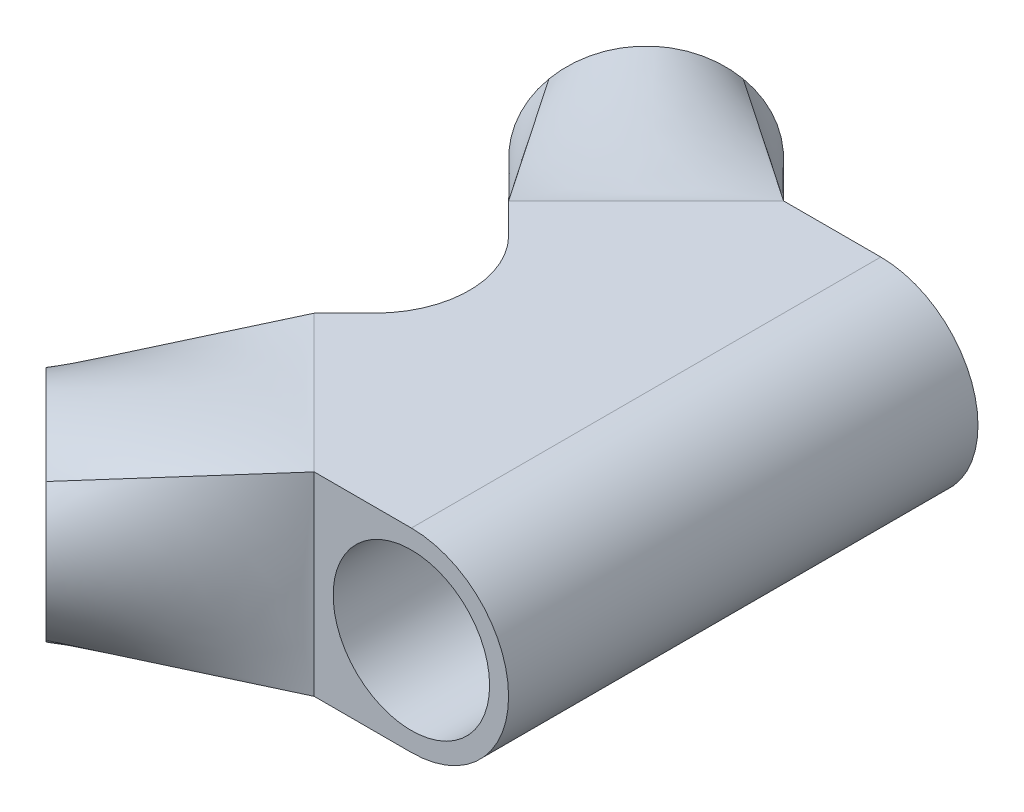
ISO-10303-21;
HEADER;
FILE_DESCRIPTION(('STEP AP214'),'2;1');
FILE_NAME('part.step','',(''),(''),'','','');
FILE_SCHEMA(('AUTOMOTIVE_DESIGN { 1 0 10303 214 1 1 1 1 }'));
ENDSEC;
DATA;
#1=APPLICATION_CONTEXT('core data for automotive mechanical design processes');
#2=APPLICATION_PROTOCOL_DEFINITION('international standard','automotive_design',2000,#1);
#3=PRODUCT_CONTEXT('',#1,'mechanical');
#4=PRODUCT('Part','Part','',(#3));
#5=PRODUCT_RELATED_PRODUCT_CATEGORY('part','',(#4));
#6=PRODUCT_DEFINITION_FORMATION('','',#4);
#7=PRODUCT_DEFINITION_CONTEXT('part definition',#1,'design');
#8=PRODUCT_DEFINITION('design','',#6,#7);
#9=PRODUCT_DEFINITION_SHAPE('','',#8);
#10=(LENGTH_UNIT() NAMED_UNIT(*) SI_UNIT(.MILLI.,.METRE.));
#11=(NAMED_UNIT(*) PLANE_ANGLE_UNIT() SI_UNIT($,.RADIAN.));
#12=(NAMED_UNIT(*) SI_UNIT($,.STERADIAN.) SOLID_ANGLE_UNIT());
#13=UNCERTAINTY_MEASURE_WITH_UNIT(LENGTH_MEASURE(1.E-05),#10,'distance_accuracy_value','');
#14=(GEOMETRIC_REPRESENTATION_CONTEXT(3) GLOBAL_UNCERTAINTY_ASSIGNED_CONTEXT((#13)) GLOBAL_UNIT_ASSIGNED_CONTEXT((#10,
#11,#12)) REPRESENTATION_CONTEXT('',''));
#15=CARTESIAN_POINT('',(0.,0.,0.));
#16=DIRECTION('',(0.,0.,1.));
#17=DIRECTION('',(1.,0.,0.));
#18=AXIS2_PLACEMENT_3D('',#15,#16,#17);
#19=CARTESIAN_POINT('',(0.,0.,49.5));
#20=DIRECTION('',(0.,0.,-1.));
#21=DIRECTION('',(-1.,0.,0.));
#22=AXIS2_PLACEMENT_3D('',#19,#20,#21);
#23=CYLINDRICAL_SURFACE('',#22,10.25);
#24=CARTESIAN_POINT('',(0.,0.,0.));
#25=DIRECTION('',(0.,0.,1.));
#26=DIRECTION('',(1.,0.,0.));
#27=AXIS2_PLACEMENT_3D('',#24,#25,#26);
#28=CIRCLE('',#27,10.25);
#29=CARTESIAN_POINT('',(0.,-10.25,0.));
#30=VERTEX_POINT('',#29);
#31=CARTESIAN_POINT('',(0.,10.25,0.));
#32=VERTEX_POINT('',#31);
#33=EDGE_CURVE('E484',#30,#32,#28,.T.);
#34=ORIENTED_EDGE('',*,*,#33,.T.);
#35=DIRECTION('',(0.,0.,-1.));
#36=VECTOR('',#35,1.);
#37=CARTESIAN_POINT('',(0.,10.25,49.5));
#38=LINE('',#37,#36);
#39=CARTESIAN_POINT('',(0.,10.25,49.5));
#40=VERTEX_POINT('',#39);
#41=EDGE_CURVE('E494',#40,#32,#38,.T.);
#42=ORIENTED_EDGE('',*,*,#41,.F.);
#43=CARTESIAN_POINT('',(0.,0.,49.5));
#44=DIRECTION('',(0.,0.,1.));
#45=DIRECTION('',(1.,0.,0.));
#46=AXIS2_PLACEMENT_3D('',#43,#44,#45);
#47=CIRCLE('',#46,10.25);
#48=CARTESIAN_POINT('',(0.,-10.25,49.5));
#49=VERTEX_POINT('',#48);
#50=EDGE_CURVE('E474',#49,#40,#47,.T.);
#51=ORIENTED_EDGE('',*,*,#50,.F.);
#52=DIRECTION('',(0.,0.,-1.));
#53=VECTOR('',#52,1.);
#54=CARTESIAN_POINT('',(0.,-10.25,49.5));
#55=LINE('',#54,#53);
#56=EDGE_CURVE('E490',#49,#30,#55,.T.);
#57=ORIENTED_EDGE('',*,*,#56,.T.);
#58=EDGE_LOOP('',(#34,#42,#51,#57));
#59=FACE_BOUND('',#58,.T.);
#60=ADVANCED_FACE('F97',(#59),#23,.T.);
#61=CARTESIAN_POINT('',(0.,10.25,49.5));
#62=DIRECTION('',(0.,-1.,0.));
#63=DIRECTION('',(0.,0.,-1.));
#64=AXIS2_PLACEMENT_3D('',#61,#62,#63);
#65=PLANE('',#64);
#66=DIRECTION('',(-1.,0.,0.));
#67=VECTOR('',#66,1.);
#68=CARTESIAN_POINT('',(0.,10.25,0.));
#69=LINE('',#68,#67);
#70=CARTESIAN_POINT('',(-10.25,10.25,0.00215549283784562));
#71=VERTEX_POINT('',#70);
#72=EDGE_CURVE('E489',#32,#71,#69,.T.);
#73=ORIENTED_EDGE('',*,*,#72,.T.);
#74=DIRECTION('',(-0.707106781186549,0.,0.707106781186546));
#75=VECTOR('',#74,1.);
#76=CARTESIAN_POINT('',(-10.2500000000002,10.25,0.00431098567550692));
#77=LINE('',#76,#75);
#78=CARTESIAN_POINT('',(-24.7456890143244,10.25,14.4999999999997));
#79=VERTEX_POINT('',#78);
#80=EDGE_CURVE('E520',#71,#79,#77,.T.);
#81=ORIENTED_EDGE('',*,*,#80,.T.);
#82=DIRECTION('',(0.707106781186544,0.,0.707106781186551));
#83=VECTOR('',#82,1.);
#84=CARTESIAN_POINT('',(-19.6228445071622,10.25,19.622844507162));
#85=LINE('',#84,#83);
#86=CARTESIAN_POINT('',(-21.5667568261897,10.25,17.6789321881345));
#87=VERTEX_POINT('',#86);
#88=EDGE_CURVE('E517',#79,#87,#85,.T.);
#89=ORIENTED_EDGE('',*,*,#88,.T.);
#90=CARTESIAN_POINT('',(-28.6378246380552,10.25,24.7499999999999));
#91=DIRECTION('',(0.,-1.,0.));
#92=DIRECTION('',(0.,0.,-1.));
#93=AXIS2_PLACEMENT_3D('',#90,#91,#92);
#94=CIRCLE('',#93,10.);
#95=CARTESIAN_POINT('',(-21.5667568261897,10.25,31.8210678118654));
#96=VERTEX_POINT('',#95);
#97=EDGE_CURVE('E12',#87,#96,#94,.T.);
#98=ORIENTED_EDGE('',*,*,#97,.T.);
#99=DIRECTION('',(0.70710678118655,0.,-0.707106781186546));
#100=VECTOR('',#99,1.);
#101=CARTESIAN_POINT('',(5.12715549283791,10.25,5.12715549283794));
#102=LINE('',#101,#100);
#103=CARTESIAN_POINT('',(-24.7456890143243,10.25,35.));
#104=VERTEX_POINT('',#103);
#105=EDGE_CURVE('E521',#104,#96,#102,.T.);
#106=ORIENTED_EDGE('',*,*,#105,.F.);
#107=DIRECTION('',(0.707106781186546,0.,0.707106781186549));
#108=VECTOR('',#107,1.);
#109=CARTESIAN_POINT('',(-24.7456890143243,10.25,34.9999999999999));
#110=LINE('',#109,#108);
#111=CARTESIAN_POINT('',(-10.25,10.25,49.4978445071621));
#112=VERTEX_POINT('',#111);
#113=EDGE_CURVE('E349',#104,#112,#110,.T.);
#114=ORIENTED_EDGE('',*,*,#113,.T.);
#115=DIRECTION('',(-1.,0.,0.));
#116=VECTOR('',#115,1.);
#117=CARTESIAN_POINT('',(0.,10.25,49.5));
#118=LINE('',#117,#116);
#119=EDGE_CURVE('E479',#40,#112,#118,.T.);
#120=ORIENTED_EDGE('',*,*,#119,.F.);
#121=ORIENTED_EDGE('',*,*,#41,.T.);
#122=EDGE_LOOP('',(#73,#81,#89,#98,#106,#114,#120,#121));
#123=FACE_BOUND('',#122,.T.);
#124=ADVANCED_FACE('F608',(#123),#65,.F.);
#125=CARTESIAN_POINT('',(0.,0.,49.5));
#126=DIRECTION('',(0.,0.,-1.));
#127=DIRECTION('',(-1.,0.,0.));
#128=AXIS2_PLACEMENT_3D('',#125,#126,#127);
#129=CYLINDRICAL_SURFACE('',#128,8.25);
#130=CARTESIAN_POINT('',(0.,0.,49.5));
#131=DIRECTION('',(0.,0.,1.));
#132=DIRECTION('',(1.,0.,0.));
#133=AXIS2_PLACEMENT_3D('',#130,#131,#132);
#134=CIRCLE('',#133,8.25);
#135=CARTESIAN_POINT('',(8.25,0.,49.5));
#136=VERTEX_POINT('',#135);
#137=EDGE_CURVE('E465',#136,#136,#134,.T.);
#138=ORIENTED_EDGE('',*,*,#137,.T.);
#139=EDGE_LOOP('',(#138));
#140=FACE_BOUND('',#139,.T.);
#141=CARTESIAN_POINT('',(0.,0.,0.));
#142=DIRECTION('',(0.,0.,1.));
#143=DIRECTION('',(1.,0.,0.));
#144=AXIS2_PLACEMENT_3D('',#141,#142,#143);
#145=CIRCLE('',#144,8.25);
#146=CARTESIAN_POINT('',(8.25,0.,0.));
#147=VERTEX_POINT('',#146);
#148=EDGE_CURVE('E480',#147,#147,#145,.T.);
#149=ORIENTED_EDGE('',*,*,#148,.F.);
#150=EDGE_LOOP('',(#149));
#151=FACE_BOUND('',#150,.T.);
#152=ADVANCED_FACE('F614',(#140,#151),#129,.F.);
#153=CARTESIAN_POINT('',(0.,-10.25,49.5));
#154=DIRECTION('',(0.,1.,0.));
#155=DIRECTION('',(0.,0.,1.));
#156=AXIS2_PLACEMENT_3D('',#153,#154,#155);
#157=PLANE('',#156);
#158=DIRECTION('',(1.,0.,0.));
#159=VECTOR('',#158,1.);
#160=CARTESIAN_POINT('',(0.,-10.25,0.));
#161=LINE('',#160,#159);
#162=CARTESIAN_POINT('',(-10.25,-10.25,0.00215549283784562));
#163=VERTEX_POINT('',#162);
#164=EDGE_CURVE('E475',#163,#30,#161,.T.);
#165=ORIENTED_EDGE('',*,*,#164,.T.);
#166=ORIENTED_EDGE('',*,*,#56,.F.);
#167=DIRECTION('',(1.,0.,0.));
#168=VECTOR('',#167,1.);
#169=CARTESIAN_POINT('',(0.,-10.25,49.5));
#170=LINE('',#169,#168);
#171=CARTESIAN_POINT('',(-10.25,-10.25,49.4978445071621));
#172=VERTEX_POINT('',#171);
#173=EDGE_CURVE('E495',#172,#49,#170,.T.);
#174=ORIENTED_EDGE('',*,*,#173,.F.);
#175=DIRECTION('',(-0.707106781186546,0.,-0.707106781186549));
#176=VECTOR('',#175,1.);
#177=CARTESIAN_POINT('',(-10.25,-10.25,49.4956890143243));
#178=LINE('',#177,#176);
#179=CARTESIAN_POINT('',(-24.7456890143243,-10.25,35.));
#180=VERTEX_POINT('',#179);
#181=EDGE_CURVE('E541',#180,#172,#178,.F.);
#182=ORIENTED_EDGE('',*,*,#181,.F.);
#183=DIRECTION('',(0.70710678118655,0.,-0.707106781186546));
#184=VECTOR('',#183,1.);
#185=CARTESIAN_POINT('',(5.12715549283791,-10.25,5.12715549283794));
#186=LINE('',#185,#184);
#187=CARTESIAN_POINT('',(-21.5667568261897,-10.25,31.8210678118654));
#188=VERTEX_POINT('',#187);
#189=EDGE_CURVE('E378',#180,#188,#186,.T.);
#190=ORIENTED_EDGE('',*,*,#189,.T.);
#191=CARTESIAN_POINT('',(-28.6378246380552,-10.25,24.7499999999999));
#192=DIRECTION('',(0.,1.,0.));
#193=DIRECTION('',(0.,0.,1.));
#194=AXIS2_PLACEMENT_3D('',#191,#192,#193);
#195=CIRCLE('',#194,10.);
#196=CARTESIAN_POINT('',(-21.5667568261897,-10.25,17.6789321881345));
#197=VERTEX_POINT('',#196);
#198=EDGE_CURVE('E106',#188,#197,#195,.T.);
#199=ORIENTED_EDGE('',*,*,#198,.T.);
#200=DIRECTION('',(0.707106781186544,0.,0.707106781186551));
#201=VECTOR('',#200,1.);
#202=CARTESIAN_POINT('',(-19.6228445071622,-10.25,19.622844507162));
#203=LINE('',#202,#201);
#204=CARTESIAN_POINT('',(-24.7456890143244,-10.25,14.4999999999997));
#205=VERTEX_POINT('',#204);
#206=EDGE_CURVE('E522',#205,#197,#203,.T.);
#207=ORIENTED_EDGE('',*,*,#206,.F.);
#208=DIRECTION('',(0.707106781186549,0.,-0.707106781186546));
#209=VECTOR('',#208,1.);
#210=CARTESIAN_POINT('',(-24.7456890143244,-10.25,14.4999999999997));
#211=LINE('',#210,#209);
#212=EDGE_CURVE('E525',#163,#205,#211,.F.);
#213=ORIENTED_EDGE('',*,*,#212,.F.);
#214=EDGE_LOOP('',(#165,#166,#174,#182,#190,#199,#207,#213));
#215=FACE_BOUND('',#214,.T.);
#216=ADVANCED_FACE('F357',(#215),#157,.F.);
#217=CARTESIAN_POINT('',(0.,0.,49.5));
#218=DIRECTION('',(0.,0.,1.));
#219=DIRECTION('',(1.,0.,0.));
#220=AXIS2_PLACEMENT_3D('',#217,#218,#219);
#221=PLANE('',#220);
#222=ORIENTED_EDGE('',*,*,#137,.F.);
#223=EDGE_LOOP('',(#222));
#224=FACE_BOUND('',#223,.T.);
#225=ORIENTED_EDGE('',*,*,#50,.T.);
#226=ORIENTED_EDGE('',*,*,#119,.T.);
#227=CARTESIAN_POINT('',(-10.2558341172134,10.2499982585414,49.5));
#228=CARTESIAN_POINT('',(-10.2549791106606,7.37044132495323,49.5));
#229=CARTESIAN_POINT('',(-10.2544835527928,4.49088428909694,49.5));
#230=CARTESIAN_POINT('',(-10.2542558134018,-0.365560338934679,49.5));
#231=CARTESIAN_POINT('',(-10.2543330292022,-2.34244792328483,49.5));
#232=CARTESIAN_POINT('',(-10.2548279971213,-6.29622310781289,49.5));
#233=CARTESIAN_POINT('',(-10.25524574925,-8.2731107079908,49.5));
#234=CARTESIAN_POINT('',(-10.2558341172134,-10.2499982585414,49.5));
#235=B_SPLINE_CURVE_WITH_KNOTS('',3,(#227,#228,#229,#230,#231,#232,#233,#234),.UNSPECIFIED.,.F.,
.F.,(4,2,2,4),(0.,8.63867114784181,14.5693338771281,20.4999967818515),.UNSPECIFIED.);
#236=EDGE_CURVE('E197',#112,#172,#235,.T.);
#237=ORIENTED_EDGE('',*,*,#236,.T.);
#238=ORIENTED_EDGE('',*,*,#173,.T.);
#239=EDGE_LOOP('',(#225,#226,#237,#238));
#240=FACE_BOUND('',#239,.T.);
#241=ADVANCED_FACE('F351',(#224,#240),#221,.T.);
#242=CARTESIAN_POINT('',(0.,0.,0.));
#243=DIRECTION('',(0.,0.,1.));
#244=DIRECTION('',(1.,0.,0.));
#245=AXIS2_PLACEMENT_3D('',#242,#243,#244);
#246=PLANE('',#245);
#247=ORIENTED_EDGE('',*,*,#148,.T.);
#248=EDGE_LOOP('',(#247));
#249=FACE_BOUND('',#248,.T.);
#250=ORIENTED_EDGE('',*,*,#33,.F.);
#251=ORIENTED_EDGE('',*,*,#164,.F.);
#252=CARTESIAN_POINT('',(-10.2558341172132,10.2499982585414,0.));
#253=CARTESIAN_POINT('',(-10.2551920380486,8.09104322047267,0.));
#254=CARTESIAN_POINT('',(-10.2547529051883,5.93208812157543,0.));
#255=CARTESIAN_POINT('',(-10.2542608662275,1.43594449311294,0.));
#256=CARTESIAN_POINT('',(-10.2542428380913,-0.901244040315821,0.));
#257=CARTESIAN_POINT('',(-10.2546820656977,-5.57562115900638,0.));
#258=CARTESIAN_POINT('',(-10.25513932146,-7.91280974426818,0.));
#259=CARTESIAN_POINT('',(-10.2558341172132,-10.2499982585414,0.));
#260=B_SPLINE_CURVE_WITH_KNOTS('',3,(#252,#253,#254,#255,#256,#257,#258,#259),.UNSPECIFIED.,.F.,
.F.,(4,2,2,4),(0.,6.47686539233136,13.488430944165,20.4999967854571),.UNSPECIFIED.);
#261=EDGE_CURVE('E376',#71,#163,#260,.T.);
#262=ORIENTED_EDGE('',*,*,#261,.F.);
#263=ORIENTED_EDGE('',*,*,#72,.F.);
#264=EDGE_LOOP('',(#250,#251,#262,#263));
#265=FACE_BOUND('',#264,.T.);
#266=ADVANCED_FACE('F356',(#249,#265),#246,.F.);
#267=CARTESIAN_POINT('',(-19.6228445071622,10.25,19.622844507162));
#268=DIRECTION('',(0.707106781186551,0.,-0.707106781186544));
#269=DIRECTION('',(-0.707106781186544,0.,-0.707106781186551));
#270=AXIS2_PLACEMENT_3D('',#267,#268,#269);
#271=PLANE('',#270);
#272=ORIENTED_EDGE('',*,*,#206,.T.);
#273=DIRECTION('',(0.,-1.,0.));
#274=VECTOR('',#273,1.);
#275=CARTESIAN_POINT('',(-21.5667568261897,10.25,17.6789321881345));
#276=LINE('',#275,#274);
#277=EDGE_CURVE('E113',#197,#87,#276,.F.);
#278=ORIENTED_EDGE('',*,*,#277,.T.);
#279=ORIENTED_EDGE('',*,*,#88,.F.);
#280=DIRECTION('',(0.,1.,0.));
#281=VECTOR('',#280,1.);
#282=CARTESIAN_POINT('',(-24.7456890143244,10.25,14.4999999999997));
#283=LINE('',#282,#281);
#284=EDGE_CURVE('E485',#79,#205,#283,.F.);
#285=ORIENTED_EDGE('',*,*,#284,.T.);
#286=EDGE_LOOP('',(#272,#278,#279,#285));
#287=FACE_BOUND('',#286,.T.);
#288=ADVANCED_FACE('F364',(#287),#271,.F.);
#289=CARTESIAN_POINT('',(5.12715549283791,10.25,5.12715549283794));
#290=DIRECTION('',(-0.707106781186545,0.,-0.707106781186549));
#291=DIRECTION('',(-0.70710678118655,0.,0.707106781186546));
#292=AXIS2_PLACEMENT_3D('',#289,#290,#291);
#293=PLANE('',#292);
#294=ORIENTED_EDGE('',*,*,#105,.T.);
#295=DIRECTION('',(0.,-1.,0.));
#296=VECTOR('',#295,1.);
#297=CARTESIAN_POINT('',(-21.5667568261897,10.25,31.8210678118654));
#298=LINE('',#297,#296);
#299=EDGE_CURVE('E499',#96,#188,#298,.T.);
#300=ORIENTED_EDGE('',*,*,#299,.T.);
#301=ORIENTED_EDGE('',*,*,#189,.F.);
#302=DIRECTION('',(0.,1.,0.));
#303=VECTOR('',#302,1.);
#304=CARTESIAN_POINT('',(-24.7456890143243,10.25,34.9999999999999));
#305=LINE('',#304,#303);
#306=EDGE_CURVE('E292',#104,#180,#305,.F.);
#307=ORIENTED_EDGE('',*,*,#306,.F.);
#308=EDGE_LOOP('',(#294,#300,#301,#307));
#309=FACE_BOUND('',#308,.T.);
#310=ADVANCED_FACE('F359',(#309),#293,.T.);
#311=CARTESIAN_POINT('',(-31.6399801308932,0.,-6.8899801308934));
#312=DIRECTION('',(-0.707106781186546,0.,-0.707106781186549));
#313=DIRECTION('',(-0.707106781186549,0.,0.707106781186546));
#314=AXIS2_PLACEMENT_3D('',#311,#312,#313);
#315=PLANE('',#314);
#316=CARTESIAN_POINT('',(-31.6399801308932,0.,-6.8899801308934));
#317=DIRECTION('',(-0.707106781186546,0.,-0.707106781186549));
#318=DIRECTION('',(-0.707106781186549,0.,0.707106781186546));
#319=AXIS2_PLACEMENT_3D('',#316,#317,#318);
#320=CIRCLE('',#319,8.25);
#321=CARTESIAN_POINT('',(-37.4736110756823,0.,-1.05634918610439));
#322=VERTEX_POINT('',#321);
#323=EDGE_CURVE('E313',#322,#322,#320,.T.);
#324=ORIENTED_EDGE('',*,*,#323,.F.);
#325=EDGE_LOOP('',(#324));
#326=FACE_BOUND('',#325,.T.);
#327=CARTESIAN_POINT('',(-31.6399801308932,0.,-6.8899801308934));
#328=DIRECTION('',(-0.707106781186546,0.,-0.707106781186549));
#329=DIRECTION('',(-0.707106781186549,0.,0.707106781186546));
#330=AXIS2_PLACEMENT_3D('',#327,#328,#329);
#331=CIRCLE('',#330,10.25);
#332=CARTESIAN_POINT('',(-36.7649801308932,-7.24784450716211,-1.76498013089341));
#333=VERTEX_POINT('',#332);
#334=CARTESIAN_POINT('',(-36.7649801308932,7.24784450716211,-1.76498013089341));
#335=VERTEX_POINT('',#334);
#336=EDGE_CURVE('E431',#333,#335,#331,.T.);
#337=ORIENTED_EDGE('',*,*,#336,.T.);
#338=CARTESIAN_POINT('',(-26.5149801308932,7.24784450716211,-12.0149801308934));
#339=VERTEX_POINT('',#338);
#340=EDGE_CURVE('E434',#335,#339,#331,.T.);
#341=ORIENTED_EDGE('',*,*,#340,.T.);
#342=CARTESIAN_POINT('',(-26.5149801308932,-7.24784450716211,-12.0149801308934));
#343=VERTEX_POINT('',#342);
#344=EDGE_CURVE('E420',#339,#343,#331,.T.);
#345=ORIENTED_EDGE('',*,*,#344,.T.);
#346=EDGE_CURVE('E410',#343,#333,#331,.T.);
#347=ORIENTED_EDGE('',*,*,#346,.T.);
#348=EDGE_LOOP('',(#337,#341,#345,#347));
#349=FACE_BOUND('',#348,.T.);
#350=ADVANCED_FACE('F446',(#326,#349),#315,.T.);
#351=CARTESIAN_POINT('',(-24.7456890143244,10.25,14.4999999999997));
#352=CARTESIAN_POINT('',(-36.7649801308932,7.24784450716211,-1.76498013089341));
#353=CARTESIAN_POINT('',(-24.1417019720609,10.25,13.8960129577362));
#354=CARTESIAN_POINT('',(-36.4629866097615,7.67492784049545,-2.06697365202517));
#355=CARTESIAN_POINT('',(-23.5377149297974,10.25,13.2920259154727));
#356=CARTESIAN_POINT('',(-36.1228530690745,8.08001585377022,-2.40710719271217));
#357=CARTESIAN_POINT('',(-22.3297408452704,10.25,12.0840518309457));
#358=CARTESIAN_POINT('',(-35.3708659317574,8.81135279277558,-3.15909433002925));
#359=CARTESIAN_POINT('',(-21.7257538030069,10.25,11.4800647886822));
#360=CARTESIAN_POINT('',(-34.9589739330102,9.13736493032478,-3.57098632877641));
#361=CARTESIAN_POINT('',(-20.5177797184799,10.25,10.2720907041552));
#362=CARTESIAN_POINT('',(-34.0783456416569,9.67634356865997,-4.45161462012968));
#363=CARTESIAN_POINT('',(-19.9137926762164,10.25,9.66810366189165));
#364=CARTESIAN_POINT('',(-33.6096782941916,9.88904589037812,-4.92028196759499));
#365=CARTESIAN_POINT('',(-18.7058185916894,10.25,8.46012957736464));
#366=CARTESIAN_POINT('',(-32.6405859853883,10.1759631573089,-5.88937427639835));
#367=CARTESIAN_POINT('',(-18.1018315494258,10.25,7.85614253510113));
#368=CARTESIAN_POINT('',(-32.1403393796995,10.25,-6.38962088208709));
#369=CARTESIAN_POINT('',(-16.8938574648988,10.25,6.64816845057411));
#370=CARTESIAN_POINT('',(-31.1396208820869,10.25,-7.39033937969971));
#371=CARTESIAN_POINT('',(-16.2898704226353,10.25,6.0441814083106));
#372=CARTESIAN_POINT('',(-30.6393742763982,10.1759631573089,-7.89058598538845));
#373=CARTESIAN_POINT('',(-15.0818963381083,10.25,4.83620732378359));
#374=CARTESIAN_POINT('',(-29.6702819675948,9.88904589037812,-8.85967829419181));
#375=CARTESIAN_POINT('',(-14.4779092958448,10.25,4.23222028152008));
#376=CARTESIAN_POINT('',(-29.2016146201295,9.67634356865998,-9.32834564165711));
#377=CARTESIAN_POINT('',(-13.2699352113178,10.25,3.02424619699306));
#378=CARTESIAN_POINT('',(-28.3209863287762,9.13736493032478,-10.2089739330104));
#379=CARTESIAN_POINT('',(-12.6659481690542,10.25,2.42025915472955));
#380=CARTESIAN_POINT('',(-27.9090943300291,8.81135279277558,-10.6208659317575));
#381=CARTESIAN_POINT('',(-11.4579740845272,10.25,1.21228507020253));
#382=CARTESIAN_POINT('',(-27.157107192712,8.08001585377022,-11.3728530690746));
#383=CARTESIAN_POINT('',(-10.8539870422637,10.25,0.60829802793902));
#384=CARTESIAN_POINT('',(-26.816973652025,7.67492784049544,-11.7129866097616));
#385=CARTESIAN_POINT('',(-10.2500000000002,10.25,0.00431098567550865));
#386=CARTESIAN_POINT('',(-26.5149801308932,7.24784450716211,-12.0149801308934));
#387=B_SPLINE_SURFACE_WITH_KNOTS('',3,1,((#351,#352),(#353,#354),(#355,#356),(#357,#358),(#359,
#360),(#361,#362),(#363,#364),(#365,#366),(#367,#368),(#369,#370),(#371,#372),(#373,#374),(#375,
#376),(#377,#378),(#379,#380),(#381,#382),(#383,#384),(#385,#386)),.UNSPECIFIED.,.F.,.F.,.F.,(4,
2,2,2,2,2,2,2,4),(2,2),(0.,0.125,0.25,0.375,0.5,0.625,0.75,0.875,1.),(0.,1.),.UNSPECIFIED.);
#388=DIRECTION('',(-0.795521560755722,-0.146835680343535,-0.587864550173618));
#389=VECTOR('',#388,1.);
#390=CARTESIAN_POINT('',(-18.3824900654467,8.74892225358106,-6.00533457260894));
#391=LINE('',#390,#389);
#392=EDGE_CURVE('E424',#71,#339,#391,.T.);
#393=DIRECTION('',(0.587864550173614,0.146835680343535,0.795521560755726));
#394=VECTOR('',#393,1.);
#395=CARTESIAN_POINT('',(-30.7553345726088,8.74892225358106,6.36750993455314));
#396=LINE('',#395,#394);
#397=EDGE_CURVE('E571',#335,#79,#396,.T.);
#398=ORIENTED_EDGE('',*,*,#80,.F.);
#399=ORIENTED_EDGE('',*,*,#392,.T.);
#400=ORIENTED_EDGE('',*,*,#340,.F.);
#401=ORIENTED_EDGE('',*,*,#397,.T.);
#402=EDGE_LOOP('',(#398,#399,#400,#401));
#403=FACE_BOUND('',#402,.T.);
#404=ADVANCED_FACE('F387',(#403),#387,.T.);
#405=CARTESIAN_POINT('',(-10.2500000000002,10.455,0.00431098567550778));
#406=CARTESIAN_POINT('',(-26.5874585759648,7.35034450716211,-11.9425016858218));
#407=CARTESIAN_POINT('',(-10.2500000000002,10.3866666666667,0.00431098567550778));
#408=CARTESIAN_POINT('',(-26.5632990942743,7.31617784049544,-11.9666611675123));
#409=CARTESIAN_POINT('',(-10.2500000000002,10.3183333333333,0.00431098567550778));
#410=CARTESIAN_POINT('',(-26.5391396125838,7.28201117382878,-11.9908206492028));
#411=CARTESIAN_POINT('',(-10.2500000000002,10.25,0.00431098567550778));
#412=CARTESIAN_POINT('',(-26.5149801308932,7.24784450716211,-12.0149801308934));
#413=CARTESIAN_POINT('',(-10.2500000000002,9.39583333333333,0.00431098567550778));
#414=CARTESIAN_POINT('',(-26.2129866097615,6.82076117382878,-12.3169736520251));
#415=CARTESIAN_POINT('',(-10.2500000000002,8.54166666666667,0.00431098567550778));
#416=CARTESIAN_POINT('',(-25.9265461285975,6.33973970757124,-12.6034141331891));
#417=CARTESIAN_POINT('',(-10.2500000000002,6.83333333333334,0.00431098567550778));
#418=CARTESIAN_POINT('',(-25.4094128196946,5.2762692992473,-13.120547442092));
#419=CARTESIAN_POINT('',(-10.2500000000002,5.97916666666667,0.00431098567550778));
#420=CARTESIAN_POINT('',(-25.1788874264844,4.6937660483861,-13.3510728353022));
#421=CARTESIAN_POINT('',(-10.2500000000002,4.27083333333333,0.00431098567550778));
#422=CARTESIAN_POINT('',(-24.7977719764029,3.44836957534485,-13.7321882853837));
#423=CARTESIAN_POINT('',(-10.2500000000002,3.41666666666667,0.00431098567550778));
#424=CARTESIAN_POINT('',(-24.6473687223419,2.78557385631799,-13.8825915394447));
#425=CARTESIAN_POINT('',(-10.2500000000002,1.70833333333334,0.00431098567550778));
#426=CARTESIAN_POINT('',(-24.4444875772556,1.41507037001682,-14.0854726845309));
#427=CARTESIAN_POINT('',(-10.2500000000002,0.854166666666669,0.00431098567550778));
#428=CARTESIAN_POINT('',(-24.3921356237311,0.707614835720704,-14.1378246380555));
#429=CARTESIAN_POINT('',(-10.2500000000002,-0.854166666666663,0.00431098567550778));
#430=CARTESIAN_POINT('',(-24.3921356237311,-0.707614835720702,-14.1378246380555));
#431=CARTESIAN_POINT('',(-10.2500000000002,-1.70833333333333,0.00431098567550778));
#432=CARTESIAN_POINT('',(-24.4444875772557,-1.41507037001682,-14.0854726845309));
#433=CARTESIAN_POINT('',(-10.2500000000002,-3.41666666666666,0.00431098567550778));
#434=CARTESIAN_POINT('',(-24.6473687223419,-2.78557385631799,-13.8825915394447));
#435=CARTESIAN_POINT('',(-10.2500000000002,-4.27083333333333,0.00431098567550778));
#436=CARTESIAN_POINT('',(-24.7977719764029,-3.44836957534485,-13.7321882853837));
#437=CARTESIAN_POINT('',(-10.2500000000002,-5.97916666666667,0.00431098567550778));
#438=CARTESIAN_POINT('',(-25.1788874264844,-4.6937660483861,-13.3510728353022));
#439=CARTESIAN_POINT('',(-10.2500000000002,-6.83333333333333,0.00431098567550778));
#440=CARTESIAN_POINT('',(-25.4094128196946,-5.2762692992473,-13.120547442092));
#441=CARTESIAN_POINT('',(-10.2500000000002,-8.54166666666667,0.00431098567550778));
#442=CARTESIAN_POINT('',(-25.9265461285975,-6.33973970757124,-12.6034141331891));
#443=CARTESIAN_POINT('',(-10.2500000000002,-9.39583333333334,0.00431098567550778));
#444=CARTESIAN_POINT('',(-26.2129866097615,-6.82076117382877,-12.3169736520251));
#445=CARTESIAN_POINT('',(-10.2500000000002,-10.25,0.00431098567550778));
#446=CARTESIAN_POINT('',(-26.5149801308932,-7.24784450716211,-12.0149801308934));
#447=CARTESIAN_POINT('',(-10.2500000000002,-10.3183333333333,0.00431098567550778));
#448=CARTESIAN_POINT('',(-26.5391396125838,-7.28201117382878,-11.9908206492028));
#449=CARTESIAN_POINT('',(-10.2500000000002,-10.3866666666667,0.00431098567550778));
#450=CARTESIAN_POINT('',(-26.5632990942743,-7.31617784049544,-11.9666611675123));
#451=CARTESIAN_POINT('',(-10.2500000000002,-10.455,0.00431098567550778));
#452=CARTESIAN_POINT('',(-26.5874585759648,-7.35034450716211,-11.9425016858218));
#453=B_SPLINE_SURFACE_WITH_KNOTS('',3,1,((#405,#406),(#407,#408),(#409,#410),(#411,#412),(#413,
#414),(#415,#416),(#417,#418),(#419,#420),(#421,#422),(#423,#424),(#425,#426),(#427,#428),(#429,
#430),(#431,#432),(#433,#434),(#435,#436),(#437,#438),(#439,#440),(#441,#442),(#443,#444),(#445,
#446),(#447,#448),(#449,#450),(#451,#452)),.UNSPECIFIED.,.F.,.F.,.F.,(4,3,2,2,2,2,2,2,2,3,4),(2,
2),(-0.01,0.,0.125,0.25,0.375,0.5,0.625,0.75,0.875,1.,1.01),(0.,1.),.UNSPECIFIED.);
#454=DIRECTION('',(-0.795521560755722,0.146835680343536,-0.587864550173618));
#455=VECTOR('',#454,1.);
#456=CARTESIAN_POINT('',(-18.3824900654467,-8.74892225358106,-6.00533457260894));
#457=LINE('',#456,#455);
#458=EDGE_CURVE('E558',#163,#343,#457,.T.);
#459=ORIENTED_EDGE('',*,*,#261,.T.);
#460=ORIENTED_EDGE('',*,*,#458,.T.);
#461=ORIENTED_EDGE('',*,*,#344,.F.);
#462=ORIENTED_EDGE('',*,*,#392,.F.);
#463=EDGE_LOOP('',(#459,#460,#461,#462));
#464=FACE_BOUND('',#463,.T.);
#465=ADVANCED_FACE('F379',(#464),#453,.T.);
#466=CARTESIAN_POINT('',(-24.7456890143244,-10.25,14.4999999999997));
#467=CARTESIAN_POINT('',(-36.7649801308932,-7.24784450716211,-1.76498013089341));
#468=CARTESIAN_POINT('',(-24.7456890143244,-9.39583333333333,14.4999999999997));
#469=CARTESIAN_POINT('',(-37.066973652025,-6.82076117382878,-1.46298660976166));
#470=CARTESIAN_POINT('',(-24.7456890143244,-8.54166666666667,14.4999999999997));
#471=CARTESIAN_POINT('',(-37.353414133189,-6.33973970757124,-1.17654612859768));
#472=CARTESIAN_POINT('',(-24.7456890143244,-6.83333333333333,14.4999999999997));
#473=CARTESIAN_POINT('',(-37.8705474420919,-5.2762692992473,-0.65941281969478));
#474=CARTESIAN_POINT('',(-24.7456890143244,-5.97916666666667,14.4999999999997));
#475=CARTESIAN_POINT('',(-38.101072835302,-4.6937660483861,-0.428887426484618));
#476=CARTESIAN_POINT('',(-24.7456890143244,-4.27083333333333,14.4999999999997));
#477=CARTESIAN_POINT('',(-38.4821882853835,-3.44836957534485,-0.0477719764031129));
#478=CARTESIAN_POINT('',(-24.7456890143244,-3.41666666666667,14.4999999999997));
#479=CARTESIAN_POINT('',(-38.6325915394446,-2.78557385631799,0.102631277657909));
#480=CARTESIAN_POINT('',(-24.7456890143244,-1.70833333333333,14.4999999999997));
#481=CARTESIAN_POINT('',(-38.8354726845308,-1.41507037001682,0.305512422744139));
#482=CARTESIAN_POINT('',(-24.7456890143244,-0.854166666666665,14.4999999999997));
#483=CARTESIAN_POINT('',(-38.8878246380553,-0.707614835720705,0.357864376268692));
#484=CARTESIAN_POINT('',(-24.7456890143244,0.854166666666668,14.4999999999997));
#485=CARTESIAN_POINT('',(-38.8878246380553,0.707614835720703,0.357864376268692));
#486=CARTESIAN_POINT('',(-24.7456890143244,1.70833333333333,14.4999999999997));
#487=CARTESIAN_POINT('',(-38.8354726845308,1.41507037001682,0.30551242274414));
#488=CARTESIAN_POINT('',(-24.7456890143244,3.41666666666667,14.4999999999997));
#489=CARTESIAN_POINT('',(-38.6325915394446,2.78557385631799,0.102631277657909));
#490=CARTESIAN_POINT('',(-24.7456890143244,4.27083333333333,14.4999999999997));
#491=CARTESIAN_POINT('',(-38.4821882853835,3.44836957534485,-0.047771976403112));
#492=CARTESIAN_POINT('',(-24.7456890143244,5.97916666666667,14.4999999999997));
#493=CARTESIAN_POINT('',(-38.101072835302,4.6937660483861,-0.428887426484617));
#494=CARTESIAN_POINT('',(-24.7456890143244,6.83333333333333,14.4999999999997));
#495=CARTESIAN_POINT('',(-37.8705474420919,5.2762692992473,-0.659412819694778));
#496=CARTESIAN_POINT('',(-24.7456890143244,8.54166666666667,14.4999999999997));
#497=CARTESIAN_POINT('',(-37.353414133189,6.33973970757124,-1.17654612859768));
#498=CARTESIAN_POINT('',(-24.7456890143244,9.39583333333333,14.4999999999997));
#499=CARTESIAN_POINT('',(-37.066973652025,6.82076117382878,-1.46298660976166));
#500=CARTESIAN_POINT('',(-24.7456890143244,10.25,14.4999999999997));
#501=CARTESIAN_POINT('',(-36.7649801308932,7.24784450716211,-1.76498013089341));
#502=B_SPLINE_SURFACE_WITH_KNOTS('',3,1,((#466,#467),(#468,#469),(#470,#471),(#472,#473),(#474,
#475),(#476,#477),(#478,#479),(#480,#481),(#482,#483),(#484,#485),(#486,#487),(#488,#489),(#490,
#491),(#492,#493),(#494,#495),(#496,#497),(#498,#499),(#500,#501)),.UNSPECIFIED.,.F.,.F.,.F.,(4,
2,2,2,2,2,2,2,4),(2,2),(0.,0.125,0.25,0.375,0.5,0.625,0.75,0.875,1.),(0.,1.),.UNSPECIFIED.);
#503=DIRECTION('',(-0.587864550173614,0.146835680343535,-0.795521560755726));
#504=VECTOR('',#503,1.);
#505=CARTESIAN_POINT('',(-30.7553345726088,-8.74892225358106,6.36750993455314));
#506=LINE('',#505,#504);
#507=EDGE_CURVE('E544',#205,#333,#506,.T.);
#508=ORIENTED_EDGE('',*,*,#284,.F.);
#509=ORIENTED_EDGE('',*,*,#397,.F.);
#510=ORIENTED_EDGE('',*,*,#336,.F.);
#511=ORIENTED_EDGE('',*,*,#507,.F.);
#512=EDGE_LOOP('',(#508,#509,#510,#511));
#513=FACE_BOUND('',#512,.T.);
#514=ADVANCED_FACE('F386',(#513),#502,.T.);
#515=CARTESIAN_POINT('',(-10.2500000000002,-10.25,0.00431098567550865));
#516=CARTESIAN_POINT('',(-26.5149801308932,-7.24784450716211,-12.0149801308934));
#517=CARTESIAN_POINT('',(-10.8539870422637,-10.25,0.608298027939017));
#518=CARTESIAN_POINT('',(-26.816973652025,-7.67492784049545,-11.7129866097616));
#519=CARTESIAN_POINT('',(-11.4579740845272,-10.25,1.21228507020253));
#520=CARTESIAN_POINT('',(-27.157107192712,-8.08001585377022,-11.3728530690746));
#521=CARTESIAN_POINT('',(-12.6659481690542,-10.25,2.42025915472954));
#522=CARTESIAN_POINT('',(-27.9090943300291,-8.81135279277558,-10.6208659317575));
#523=CARTESIAN_POINT('',(-13.2699352113177,-10.25,3.02424619699305));
#524=CARTESIAN_POINT('',(-28.3209863287762,-9.13736493032478,-10.2089739330104));
#525=CARTESIAN_POINT('',(-14.4779092958448,-10.25,4.23222028152006));
#526=CARTESIAN_POINT('',(-29.2016146201295,-9.67634356865998,-9.32834564165711));
#527=CARTESIAN_POINT('',(-15.0818963381083,-10.25,4.83620732378357));
#528=CARTESIAN_POINT('',(-29.6702819675948,-9.88904589037812,-8.85967829419181));
#529=CARTESIAN_POINT('',(-16.2898704226353,-10.25,6.04418140831059));
#530=CARTESIAN_POINT('',(-30.6393742763982,-10.1759631573089,-7.89058598538845));
#531=CARTESIAN_POINT('',(-16.8938574648988,-10.25,6.6481684505741));
#532=CARTESIAN_POINT('',(-31.1396208820869,-10.25,-7.39033937969971));
#533=CARTESIAN_POINT('',(-18.1018315494258,-10.25,7.85614253510111));
#534=CARTESIAN_POINT('',(-32.1403393796995,-10.25,-6.38962088208709));
#535=CARTESIAN_POINT('',(-18.7058185916893,-10.25,8.46012957736462));
#536=CARTESIAN_POINT('',(-32.6405859853883,-10.1759631573089,-5.88937427639835));
#537=CARTESIAN_POINT('',(-19.9137926762164,-10.25,9.66810366189163));
#538=CARTESIAN_POINT('',(-33.6096782941917,-9.88904589037812,-4.92028196759499));
#539=CARTESIAN_POINT('',(-20.5177797184799,-10.25,10.2720907041551));
#540=CARTESIAN_POINT('',(-34.078345641657,-9.67634356865998,-4.45161462012969));
#541=CARTESIAN_POINT('',(-21.7257538030069,-10.25,11.4800647886822));
#542=CARTESIAN_POINT('',(-34.9589739330102,-9.13736493032478,-3.57098632877641));
#543=CARTESIAN_POINT('',(-22.3297408452704,-10.25,12.0840518309457));
#544=CARTESIAN_POINT('',(-35.3708659317574,-8.81135279277558,-3.15909433002925));
#545=CARTESIAN_POINT('',(-23.5377149297974,-10.25,13.2920259154727));
#546=CARTESIAN_POINT('',(-36.1228530690745,-8.08001585377022,-2.40710719271217));
#547=CARTESIAN_POINT('',(-24.1417019720609,-10.25,13.8960129577362));
#548=CARTESIAN_POINT('',(-36.4629866097615,-7.67492784049545,-2.06697365202517));
#549=CARTESIAN_POINT('',(-24.7456890143244,-10.25,14.4999999999997));
#550=CARTESIAN_POINT('',(-36.7649801308932,-7.24784450716211,-1.76498013089341));
#551=B_SPLINE_SURFACE_WITH_KNOTS('',3,1,((#515,#516),(#517,#518),(#519,#520),(#521,#522),(#523,
#524),(#525,#526),(#527,#528),(#529,#530),(#531,#532),(#533,#534),(#535,#536),(#537,#538),(#539,
#540),(#541,#542),(#543,#544),(#545,#546),(#547,#548),(#549,#550)),.UNSPECIFIED.,.F.,.F.,.F.,(4,
2,2,2,2,2,2,2,4),(2,2),(0.,0.125,0.25,0.375,0.5,0.625,0.75,0.875,1.),(0.,1.),.UNSPECIFIED.);
#552=ORIENTED_EDGE('',*,*,#212,.T.);
#553=ORIENTED_EDGE('',*,*,#507,.T.);
#554=ORIENTED_EDGE('',*,*,#346,.F.);
#555=ORIENTED_EDGE('',*,*,#458,.F.);
#556=EDGE_LOOP('',(#552,#553,#554,#555));
#557=FACE_BOUND('',#556,.T.);
#558=ADVANCED_FACE('F563',(#557),#551,.T.);
#559=CARTESIAN_POINT('',(-17.4978445071623,0.,7.25215549283759));
#560=DIRECTION('',(-0.707106781186546,0.,-0.707106781186549));
#561=DIRECTION('',(-0.707106781186549,0.,0.707106781186546));
#562=AXIS2_PLACEMENT_3D('',#559,#560,#561);
#563=CYLINDRICAL_SURFACE('',#562,8.25);
#564=CARTESIAN_POINT('',(-17.4978445071623,0.,7.25215549283759));
#565=DIRECTION('',(-0.707106781186546,0.,-0.707106781186549));
#566=DIRECTION('',(-0.707106781186549,0.,0.707106781186546));
#567=AXIS2_PLACEMENT_3D('',#564,#565,#566);
#568=CIRCLE('',#567,8.25);
#569=CARTESIAN_POINT('',(-23.3314754519513,0.,13.0857864376266));
#570=VERTEX_POINT('',#569);
#571=EDGE_CURVE('E234',#570,#570,#568,.T.);
#572=ORIENTED_EDGE('',*,*,#571,.F.);
#573=EDGE_LOOP('',(#572));
#574=FACE_BOUND('',#573,.T.);
#575=ORIENTED_EDGE('',*,*,#323,.T.);
#576=EDGE_LOOP('',(#575));
#577=FACE_BOUND('',#576,.T.);
#578=ADVANCED_FACE('F455',(#574,#577),#563,.F.);
#579=CARTESIAN_POINT('',(-17.4978445071623,0.,7.25215549283759));
#580=DIRECTION('',(-0.707106781186546,0.,-0.707106781186549));
#581=DIRECTION('',(-0.707106781186549,0.,0.707106781186546));
#582=AXIS2_PLACEMENT_3D('',#579,#580,#581);
#583=PLANE('',#582);
#584=ORIENTED_EDGE('',*,*,#571,.T.);
#585=EDGE_LOOP('',(#584));
#586=FACE_BOUND('',#585,.T.);
#587=ADVANCED_FACE('F246',(#586),#583,.T.);
#588=CARTESIAN_POINT('',(-31.6399801308932,0.,56.389980130893));
#589=DIRECTION('',(-0.707106781186549,0.,0.707106781186546));
#590=DIRECTION('',(0.707106781186546,0.,0.707106781186549));
#591=AXIS2_PLACEMENT_3D('',#588,#589,#590);
#592=PLANE('',#591);
#593=CARTESIAN_POINT('',(-31.6399801308932,0.,56.389980130893));
#594=DIRECTION('',(-0.707106781186549,0.,0.707106781186546));
#595=DIRECTION('',(0.707106781186546,0.,0.707106781186549));
#596=AXIS2_PLACEMENT_3D('',#593,#594,#595);
#597=CIRCLE('',#596,8.25);
#598=CARTESIAN_POINT('',(-25.8063491861042,0.,62.223611075682));
#599=VERTEX_POINT('',#598);
#600=EDGE_CURVE('E275',#599,#599,#597,.T.);
#601=ORIENTED_EDGE('',*,*,#600,.F.);
#602=EDGE_LOOP('',(#601));
#603=FACE_BOUND('',#602,.T.);
#604=CARTESIAN_POINT('',(-31.6399801308932,0.,56.389980130893));
#605=DIRECTION('',(-0.707106781186549,0.,0.707106781186546));
#606=DIRECTION('',(0.707106781186546,0.,0.707106781186549));
#607=AXIS2_PLACEMENT_3D('',#604,#605,#606);
#608=CIRCLE('',#607,10.25);
#609=CARTESIAN_POINT('',(-26.5149801308932,7.24784450716209,61.514980130893));
#610=VERTEX_POINT('',#609);
#611=CARTESIAN_POINT('',(-36.7649801308932,7.24784450716209,51.264980130893));
#612=VERTEX_POINT('',#611);
#613=EDGE_CURVE('E205',#610,#612,#608,.T.);
#614=ORIENTED_EDGE('',*,*,#613,.T.);
#615=CARTESIAN_POINT('',(-36.7649801308932,-7.24784450716209,51.264980130893));
#616=VERTEX_POINT('',#615);
#617=EDGE_CURVE('E214',#612,#616,#608,.T.);
#618=ORIENTED_EDGE('',*,*,#617,.T.);
#619=CARTESIAN_POINT('',(-26.5149801308932,-7.24784450716209,61.514980130893));
#620=VERTEX_POINT('',#619);
#621=EDGE_CURVE('E221',#616,#620,#608,.T.);
#622=ORIENTED_EDGE('',*,*,#621,.T.);
#623=EDGE_CURVE('E193',#620,#610,#608,.T.);
#624=ORIENTED_EDGE('',*,*,#623,.T.);
#625=EDGE_LOOP('',(#614,#618,#622,#624));
#626=FACE_BOUND('',#625,.T.);
#627=ADVANCED_FACE('F219',(#603,#626),#592,.T.);
#628=CARTESIAN_POINT('',(-36.7649801308932,-7.24784450716209,51.264980130893));
#629=CARTESIAN_POINT('',(-24.7456890143243,-10.25,34.9999999999999));
#630=CARTESIAN_POINT('',(-37.0669736520249,-6.82076117382876,50.9629866097612));
#631=CARTESIAN_POINT('',(-24.7456890143243,-9.39583333333333,34.9999999999999));
#632=CARTESIAN_POINT('',(-37.3534141331889,-6.33973970757123,50.6765461285972));
#633=CARTESIAN_POINT('',(-24.7456890143243,-8.54166666666666,34.9999999999999));
#634=CARTESIAN_POINT('',(-37.8705474420918,-5.27626929924728,50.1594128196943));
#635=CARTESIAN_POINT('',(-24.7456890143243,-6.83333333333333,34.9999999999999));
#636=CARTESIAN_POINT('',(-38.101072835302,-4.69376604838608,49.9288874264842));
#637=CARTESIAN_POINT('',(-24.7456890143243,-5.97916666666666,34.9999999999999));
#638=CARTESIAN_POINT('',(-38.4821882853835,-3.44836957534484,49.5477719764027));
#639=CARTESIAN_POINT('',(-24.7456890143243,-4.27083333333333,34.9999999999999));
#640=CARTESIAN_POINT('',(-38.6325915394445,-2.78557385631798,49.3973687223416));
#641=CARTESIAN_POINT('',(-24.7456890143243,-3.41666666666666,34.9999999999999));
#642=CARTESIAN_POINT('',(-38.8354726845307,-1.41507037001681,49.1944875772554));
#643=CARTESIAN_POINT('',(-24.7456890143243,-1.70833333333333,34.9999999999999));
#644=CARTESIAN_POINT('',(-38.8878246380553,-0.707614835720701,49.1421356237309));
#645=CARTESIAN_POINT('',(-24.7456890143243,-0.854166666666663,34.9999999999999));
#646=CARTESIAN_POINT('',(-38.8878246380553,0.707614835720702,49.1421356237309));
#647=CARTESIAN_POINT('',(-24.7456890143243,0.854166666666671,34.9999999999999));
#648=CARTESIAN_POINT('',(-38.8354726845307,1.41507037001682,49.1944875772554));
#649=CARTESIAN_POINT('',(-24.7456890143243,1.70833333333334,34.9999999999999));
#650=CARTESIAN_POINT('',(-38.6325915394445,2.78557385631798,49.3973687223416));
#651=CARTESIAN_POINT('',(-24.7456890143243,3.41666666666667,34.9999999999999));
#652=CARTESIAN_POINT('',(-38.4821882853835,3.44836957534484,49.5477719764027));
#653=CARTESIAN_POINT('',(-24.7456890143243,4.27083333333334,34.9999999999999));
#654=CARTESIAN_POINT('',(-38.1010728353019,4.69376604838608,49.9288874264842));
#655=CARTESIAN_POINT('',(-24.7456890143243,5.97916666666667,34.9999999999999));
#656=CARTESIAN_POINT('',(-37.8705474420918,5.27626929924728,50.1594128196943));
#657=CARTESIAN_POINT('',(-24.7456890143243,6.83333333333334,34.9999999999999));
#658=CARTESIAN_POINT('',(-37.3534141331889,6.33973970757123,50.6765461285972));
#659=CARTESIAN_POINT('',(-24.7456890143243,8.54166666666667,34.9999999999999));
#660=CARTESIAN_POINT('',(-37.0669736520249,6.82076117382876,50.9629866097612));
#661=CARTESIAN_POINT('',(-24.7456890143243,9.39583333333334,34.9999999999999));
#662=CARTESIAN_POINT('',(-36.7649801308932,7.24784450716209,51.264980130893));
#663=CARTESIAN_POINT('',(-24.7456890143243,10.25,34.9999999999999));
#664=B_SPLINE_SURFACE_WITH_KNOTS('',3,1,((#628,#629),(#630,#631),(#632,#633),(#634,#635),(#636,
#637),(#638,#639),(#640,#641),(#642,#643),(#644,#645),(#646,#647),(#648,#649),(#650,#651),(#652,
#653),(#654,#655),(#656,#657),(#658,#659),(#660,#661),(#662,#663)),.UNSPECIFIED.,.F.,.F.,.F.,(4,
2,2,2,2,2,2,2,4),(2,2),(0.,0.125,0.25,0.375,0.5,0.625,0.75,0.875,1.),(0.,1.),.UNSPECIFIED.);
#665=DIRECTION('',(0.587864550173619,0.146835680343536,-0.795521560755722));
#666=VECTOR('',#665,1.);
#667=CARTESIAN_POINT('',(-30.7553345726087,8.74892225358105,43.1324900654464));
#668=LINE('',#667,#666);
#669=EDGE_CURVE('E202',#612,#104,#668,.T.);
#670=DIRECTION('',(-0.587864550173619,0.146835680343536,0.795521560755722));
#671=VECTOR('',#670,1.);
#672=CARTESIAN_POINT('',(-30.7553345726087,-8.74892225358105,43.1324900654464));
#673=LINE('',#672,#671);
#674=EDGE_CURVE('E213',#180,#616,#673,.T.);
#675=ORIENTED_EDGE('',*,*,#617,.F.);
#676=ORIENTED_EDGE('',*,*,#669,.T.);
#677=ORIENTED_EDGE('',*,*,#306,.T.);
#678=ORIENTED_EDGE('',*,*,#674,.T.);
#679=EDGE_LOOP('',(#675,#676,#677,#678));
#680=FACE_BOUND('',#679,.T.);
#681=ADVANCED_FACE('F245',(#680),#664,.T.);
#682=CARTESIAN_POINT('',(-36.7649801308932,7.24784450716209,51.264980130893));
#683=CARTESIAN_POINT('',(-24.7456890143243,10.25,34.9999999999999));
#684=CARTESIAN_POINT('',(-36.4629866097614,7.67492784049543,51.5669736520247));
#685=CARTESIAN_POINT('',(-24.1417019720607,10.25,35.6039870422635));
#686=CARTESIAN_POINT('',(-36.1228530690744,8.08001585377021,51.9071071927117));
#687=CARTESIAN_POINT('',(-23.5377149297972,10.25,36.207974084527));
#688=CARTESIAN_POINT('',(-35.3708659317573,8.81135279277557,52.6590943300288));
#689=CARTESIAN_POINT('',(-22.3297408452702,10.25,37.415948169054));
#690=CARTESIAN_POINT('',(-34.9589739330102,9.13736493032478,53.070986328776));
#691=CARTESIAN_POINT('',(-21.7257538030067,10.25,38.0199352113175));
#692=CARTESIAN_POINT('',(-34.0783456416569,9.67634356865997,53.9516146201293));
#693=CARTESIAN_POINT('',(-20.5177797184797,10.25,39.2279092958446));
#694=CARTESIAN_POINT('',(-33.6096782941916,9.88904589037811,54.4202819675946));
#695=CARTESIAN_POINT('',(-19.9137926762161,10.25,39.8318963381081));
#696=CARTESIAN_POINT('',(-32.6405859853882,10.1759631573088,55.3893742763979));
#697=CARTESIAN_POINT('',(-18.7058185916891,10.25,41.0398704226351));
#698=CARTESIAN_POINT('',(-32.1403393796995,10.25,55.8896208820867));
#699=CARTESIAN_POINT('',(-18.1018315494256,10.25,41.6438574648986));
#700=CARTESIAN_POINT('',(-31.1396208820869,10.25,56.8903393796993));
#701=CARTESIAN_POINT('',(-16.8938574648986,10.25,42.8518315494257));
#702=CARTESIAN_POINT('',(-30.6393742763981,10.1759631573089,57.3905859853881));
#703=CARTESIAN_POINT('',(-16.2898704226351,10.25,43.4558185916892));
#704=CARTESIAN_POINT('',(-29.6702819675948,9.88904589037812,58.3596782941914));
#705=CARTESIAN_POINT('',(-15.0818963381081,10.25,44.6637926762162));
#706=CARTESIAN_POINT('',(-29.2016146201294,9.67634356865997,58.8283456416567));
#707=CARTESIAN_POINT('',(-14.4779092958445,10.25,45.2677797184797));
#708=CARTESIAN_POINT('',(-28.3209863287762,9.13736493032478,59.70897393301));
#709=CARTESIAN_POINT('',(-13.2699352113175,10.25,46.4757538030067));
#710=CARTESIAN_POINT('',(-27.909094330029,8.81135279277557,60.1208659317572));
#711=CARTESIAN_POINT('',(-12.665948169054,10.25,47.0797408452702));
#712=CARTESIAN_POINT('',(-27.1571071927119,8.08001585377021,60.8728530690743));
#713=CARTESIAN_POINT('',(-11.457974084527,10.25,48.2877149297973));
#714=CARTESIAN_POINT('',(-26.8169736520249,7.67492784049543,61.2129866097613));
#715=CARTESIAN_POINT('',(-10.8539870422635,10.25,48.8917019720608));
#716=CARTESIAN_POINT('',(-26.5149801308932,7.24784450716209,61.514980130893));
#717=CARTESIAN_POINT('',(-10.25,10.25,49.4956890143243));
#718=B_SPLINE_SURFACE_WITH_KNOTS('',3,1,((#682,#683),(#684,#685),(#686,#687),(#688,#689),(#690,
#691),(#692,#693),(#694,#695),(#696,#697),(#698,#699),(#700,#701),(#702,#703),(#704,#705),(#706,
#707),(#708,#709),(#710,#711),(#712,#713),(#714,#715),(#716,#717)),.UNSPECIFIED.,.F.,.F.,.F.,(4,
2,2,2,2,2,2,2,4),(2,2),(0.,0.125,0.25,0.375,0.5,0.625,0.75,0.875,1.),(0.,1.),.UNSPECIFIED.);
#719=DIRECTION('',(0.795521560755728,0.146835680343536,-0.58786455017361));
#720=VECTOR('',#719,1.);
#721=CARTESIAN_POINT('',(-18.3824900654466,8.74892225358105,55.5053345726086));
#722=LINE('',#721,#720);
#723=EDGE_CURVE('E188',#610,#112,#722,.T.);
#724=ORIENTED_EDGE('',*,*,#613,.F.);
#725=ORIENTED_EDGE('',*,*,#723,.T.);
#726=ORIENTED_EDGE('',*,*,#113,.F.);
#727=ORIENTED_EDGE('',*,*,#669,.F.);
#728=EDGE_LOOP('',(#724,#725,#726,#727));
#729=FACE_BOUND('',#728,.T.);
#730=ADVANCED_FACE('F207',(#729),#718,.T.);
#731=CARTESIAN_POINT('',(-26.5149801308932,-7.24784450716209,61.514980130893));
#732=CARTESIAN_POINT('',(-10.25,-10.25,49.4956890143243));
#733=CARTESIAN_POINT('',(-26.8169736520249,-7.67492784049543,61.2129866097613));
#734=CARTESIAN_POINT('',(-10.8539870422635,-10.25,48.8917019720608));
#735=CARTESIAN_POINT('',(-27.1571071927119,-8.08001585377021,60.8728530690743));
#736=CARTESIAN_POINT('',(-11.457974084527,-10.25,48.2877149297973));
#737=CARTESIAN_POINT('',(-27.909094330029,-8.81135279277557,60.1208659317572));
#738=CARTESIAN_POINT('',(-12.665948169054,-10.25,47.0797408452703));
#739=CARTESIAN_POINT('',(-28.3209863287762,-9.13736493032478,59.70897393301));
#740=CARTESIAN_POINT('',(-13.2699352113175,-10.25,46.4757538030068));
#741=CARTESIAN_POINT('',(-29.2016146201294,-9.67634356865997,58.8283456416567));
#742=CARTESIAN_POINT('',(-14.4779092958445,-10.25,45.2677797184797));
#743=CARTESIAN_POINT('',(-29.6702819675948,-9.88904589037811,58.3596782941914));
#744=CARTESIAN_POINT('',(-15.081896338108,-10.25,44.6637926762162));
#745=CARTESIAN_POINT('',(-30.6393742763981,-10.1759631573088,57.3905859853881));
#746=CARTESIAN_POINT('',(-16.2898704226351,-10.25,43.4558185916892));
#747=CARTESIAN_POINT('',(-31.1396208820869,-10.25,56.8903393796993));
#748=CARTESIAN_POINT('',(-16.8938574648986,-10.25,42.8518315494257));
#749=CARTESIAN_POINT('',(-32.1403393796995,-10.25,55.8896208820867));
#750=CARTESIAN_POINT('',(-18.1018315494256,-10.25,41.6438574648986));
#751=CARTESIAN_POINT('',(-32.6405859853882,-10.1759631573088,55.3893742763979));
#752=CARTESIAN_POINT('',(-18.7058185916891,-10.25,41.0398704226351));
#753=CARTESIAN_POINT('',(-33.6096782941916,-9.88904589037811,54.4202819675946));
#754=CARTESIAN_POINT('',(-19.9137926762161,-10.25,39.8318963381081));
#755=CARTESIAN_POINT('',(-34.0783456416569,-9.67634356865997,53.9516146201292));
#756=CARTESIAN_POINT('',(-20.5177797184796,-10.25,39.2279092958446));
#757=CARTESIAN_POINT('',(-34.9589739330102,-9.13736493032477,53.070986328776));
#758=CARTESIAN_POINT('',(-21.7257538030067,-10.25,38.0199352113175));
#759=CARTESIAN_POINT('',(-35.3708659317573,-8.81135279277557,52.6590943300288));
#760=CARTESIAN_POINT('',(-22.3297408452702,-10.25,37.415948169054));
#761=CARTESIAN_POINT('',(-36.1228530690744,-8.0800158537702,51.9071071927117));
#762=CARTESIAN_POINT('',(-23.5377149297972,-10.25,36.207974084527));
#763=CARTESIAN_POINT('',(-36.4629866097614,-7.67492784049543,51.5669736520247));
#764=CARTESIAN_POINT('',(-24.1417019720607,-10.25,35.6039870422635));
#765=CARTESIAN_POINT('',(-36.7649801308932,-7.24784450716209,51.264980130893));
#766=CARTESIAN_POINT('',(-24.7456890143243,-10.25,34.9999999999999));
#767=B_SPLINE_SURFACE_WITH_KNOTS('',3,1,((#731,#732),(#733,#734),(#735,#736),(#737,#738),(#739,
#740),(#741,#742),(#743,#744),(#745,#746),(#747,#748),(#749,#750),(#751,#752),(#753,#754),(#755,
#756),(#757,#758),(#759,#760),(#761,#762),(#763,#764),(#765,#766)),.UNSPECIFIED.,.F.,.F.,.F.,(4,
2,2,2,2,2,2,2,4),(2,2),(0.,0.125,0.25,0.375,0.5,0.625,0.75,0.875,1.),(0.,1.),.UNSPECIFIED.);
#768=DIRECTION('',(0.795521560755728,-0.146835680343536,-0.58786455017361));
#769=VECTOR('',#768,1.);
#770=CARTESIAN_POINT('',(-18.3824900654466,-8.74892225358105,55.5053345726086));
#771=LINE('',#770,#769);
#772=EDGE_CURVE('E201',#620,#172,#771,.T.);
#773=ORIENTED_EDGE('',*,*,#621,.F.);
#774=ORIENTED_EDGE('',*,*,#674,.F.);
#775=ORIENTED_EDGE('',*,*,#181,.T.);
#776=ORIENTED_EDGE('',*,*,#772,.F.);
#777=EDGE_LOOP('',(#773,#774,#775,#776));
#778=FACE_BOUND('',#777,.T.);
#779=ADVANCED_FACE('F288',(#778),#767,.T.);
#780=CARTESIAN_POINT('',(-26.5874585759648,7.35034450716209,61.4425016858214));
#781=CARTESIAN_POINT('',(-10.25,10.455,49.4956890143243));
#782=CARTESIAN_POINT('',(-26.5632990942743,7.31617784049542,61.4666611675119));
#783=CARTESIAN_POINT('',(-10.25,10.3866666666667,49.4956890143243));
#784=CARTESIAN_POINT('',(-26.5391396125837,7.28201117382876,61.4908206492025));
#785=CARTESIAN_POINT('',(-10.25,10.3183333333333,49.4956890143243));
#786=CARTESIAN_POINT('',(-26.5149801308932,7.24784450716209,61.514980130893));
#787=CARTESIAN_POINT('',(-10.25,10.25,49.4956890143243));
#788=CARTESIAN_POINT('',(-26.2129866097614,6.82076117382876,61.8169736520248));
#789=CARTESIAN_POINT('',(-10.25,9.39583333333333,49.4956890143243));
#790=CARTESIAN_POINT('',(-25.9265461285974,6.33973970757123,62.1034141331888));
#791=CARTESIAN_POINT('',(-10.25,8.54166666666667,49.4956890143243));
#792=CARTESIAN_POINT('',(-25.4094128196945,5.27626929924728,62.6205474420916));
#793=CARTESIAN_POINT('',(-10.25,6.83333333333334,49.4956890143243));
#794=CARTESIAN_POINT('',(-25.1788874264844,4.69376604838608,62.8510728353018));
#795=CARTESIAN_POINT('',(-10.25,5.97916666666667,49.4956890143243));
#796=CARTESIAN_POINT('',(-24.7977719764029,3.44836957534484,63.2321882853833));
#797=CARTESIAN_POINT('',(-10.25,4.27083333333333,49.4956890143243));
#798=CARTESIAN_POINT('',(-24.6473687223419,2.78557385631798,63.3825915394443));
#799=CARTESIAN_POINT('',(-10.25,3.41666666666666,49.4956890143243));
#800=CARTESIAN_POINT('',(-24.4444875772556,1.41507037001681,63.5854726845306));
#801=CARTESIAN_POINT('',(-10.25,1.70833333333333,49.4956890143243));
#802=CARTESIAN_POINT('',(-24.3921356237311,0.707614835720701,63.6378246380551));
#803=CARTESIAN_POINT('',(-10.25,0.854166666666661,49.4956890143243));
#804=CARTESIAN_POINT('',(-24.3921356237311,-0.707614835720703,63.6378246380551));
#805=CARTESIAN_POINT('',(-10.25,-0.854166666666674,49.4956890143243));
#806=CARTESIAN_POINT('',(-24.4444875772556,-1.41507037001682,63.5854726845306));
#807=CARTESIAN_POINT('',(-10.25,-1.70833333333334,49.4956890143243));
#808=CARTESIAN_POINT('',(-24.6473687223419,-2.78557385631798,63.3825915394443));
#809=CARTESIAN_POINT('',(-10.25,-3.41666666666668,49.4956890143243));
#810=CARTESIAN_POINT('',(-24.7977719764029,-3.44836957534484,63.2321882853833));
#811=CARTESIAN_POINT('',(-10.25,-4.27083333333334,49.4956890143243));
#812=CARTESIAN_POINT('',(-25.1788874264844,-4.69376604838609,62.8510728353018));
#813=CARTESIAN_POINT('',(-10.25,-5.97916666666668,49.4956890143243));
#814=CARTESIAN_POINT('',(-25.4094128196945,-5.27626929924728,62.6205474420917));
#815=CARTESIAN_POINT('',(-10.25,-6.83333333333335,49.4956890143243));
#816=CARTESIAN_POINT('',(-25.9265461285974,-6.33973970757123,62.1034141331888));
#817=CARTESIAN_POINT('',(-10.25,-8.54166666666668,49.4956890143243));
#818=CARTESIAN_POINT('',(-26.2129866097614,-6.82076117382876,61.8169736520248));
#819=CARTESIAN_POINT('',(-10.25,-9.39583333333334,49.4956890143243));
#820=CARTESIAN_POINT('',(-26.5149801308932,-7.24784450716209,61.514980130893));
#821=CARTESIAN_POINT('',(-10.25,-10.25,49.4956890143243));
#822=CARTESIAN_POINT('',(-26.5391396125837,-7.28201117382876,61.4908206492025));
#823=CARTESIAN_POINT('',(-10.25,-10.3183333333333,49.4956890143243));
#824=CARTESIAN_POINT('',(-26.5632990942743,-7.31617784049543,61.4666611675119));
#825=CARTESIAN_POINT('',(-10.25,-10.3866666666667,49.4956890143243));
#826=CARTESIAN_POINT('',(-26.5874585759648,-7.35034450716209,61.4425016858214));
#827=CARTESIAN_POINT('',(-10.25,-10.455,49.4956890143243));
#828=B_SPLINE_SURFACE_WITH_KNOTS('',3,1,((#780,#781),(#782,#783),(#784,#785),(#786,#787),(#788,
#789),(#790,#791),(#792,#793),(#794,#795),(#796,#797),(#798,#799),(#800,#801),(#802,#803),(#804,
#805),(#806,#807),(#808,#809),(#810,#811),(#812,#813),(#814,#815),(#816,#817),(#818,#819),(#820,
#821),(#822,#823),(#824,#825),(#826,#827)),.UNSPECIFIED.,.F.,.F.,.F.,(4,3,2,2,2,2,2,2,2,3,4),(2,
2),(-0.01,0.,0.125,0.25,0.375,0.5,0.625,0.75,0.875,1.,1.01),(0.,1.),.UNSPECIFIED.);
#829=ORIENTED_EDGE('',*,*,#623,.F.);
#830=ORIENTED_EDGE('',*,*,#772,.T.);
#831=ORIENTED_EDGE('',*,*,#236,.F.);
#832=ORIENTED_EDGE('',*,*,#723,.F.);
#833=EDGE_LOOP('',(#829,#830,#831,#832));
#834=FACE_BOUND('',#833,.T.);
#835=ADVANCED_FACE('F190',(#834),#828,.T.);
#836=CARTESIAN_POINT('',(-17.4978445071622,0.,42.2478445071621));
#837=DIRECTION('',(-0.707106781186549,0.,0.707106781186546));
#838=DIRECTION('',(0.707106781186546,0.,0.707106781186549));
#839=AXIS2_PLACEMENT_3D('',#836,#837,#838);
#840=CYLINDRICAL_SURFACE('',#839,8.25);
#841=CARTESIAN_POINT('',(-17.4978445071622,0.,42.2478445071621));
#842=DIRECTION('',(-0.707106781186549,0.,0.707106781186546));
#843=DIRECTION('',(0.707106781186546,0.,0.707106781186549));
#844=AXIS2_PLACEMENT_3D('',#841,#842,#843);
#845=CIRCLE('',#844,8.25);
#846=CARTESIAN_POINT('',(-11.6642135623732,0.,48.0814754519511));
#847=VERTEX_POINT('',#846);
#848=EDGE_CURVE('E224',#847,#847,#845,.T.);
#849=ORIENTED_EDGE('',*,*,#848,.F.);
#850=EDGE_LOOP('',(#849));
#851=FACE_BOUND('',#850,.T.);
#852=ORIENTED_EDGE('',*,*,#600,.T.);
#853=EDGE_LOOP('',(#852));
#854=FACE_BOUND('',#853,.T.);
#855=ADVANCED_FACE('F248',(#851,#854),#840,.F.);
#856=CARTESIAN_POINT('',(-17.4978445071622,0.,42.2478445071621));
#857=DIRECTION('',(-0.707106781186549,0.,0.707106781186546));
#858=DIRECTION('',(0.707106781186546,0.,0.707106781186549));
#859=AXIS2_PLACEMENT_3D('',#856,#857,#858);
#860=PLANE('',#859);
#861=ORIENTED_EDGE('',*,*,#848,.T.);
#862=EDGE_LOOP('',(#861));
#863=FACE_BOUND('',#862,.T.);
#864=ADVANCED_FACE('F705',(#863),#860,.T.);
#865=CARTESIAN_POINT('',(-28.6378246380552,10.25,24.7499999999999));
#866=DIRECTION('',(0.,-1.,0.));
#867=DIRECTION('',(0.,0.,-1.));
#868=AXIS2_PLACEMENT_3D('',#865,#866,#867);
#869=CYLINDRICAL_SURFACE('',#868,10.);
#870=ORIENTED_EDGE('',*,*,#97,.F.);
#871=ORIENTED_EDGE('',*,*,#277,.F.);
#872=ORIENTED_EDGE('',*,*,#198,.F.);
#873=ORIENTED_EDGE('',*,*,#299,.F.);
#874=EDGE_LOOP('',(#870,#871,#872,#873));
#875=FACE_BOUND('',#874,.T.);
#876=ADVANCED_FACE('F99',(#875),#869,.F.);
#877=CLOSED_SHELL('',(#60,#124,#152,#216,#241,#266,#288,#310,#350,#404,#465,#514,#558,#578,#587,
#627,#681,#730,#779,#835,#855,#864,#876));
#878=MANIFOLD_SOLID_BREP('B2',#877);
#879=ADVANCED_BREP_SHAPE_REPRESENTATION('',(#18,#878),#14);
#880=SHAPE_DEFINITION_REPRESENTATION(#9,#879);
ENDSEC;
END-ISO-10303-21;
